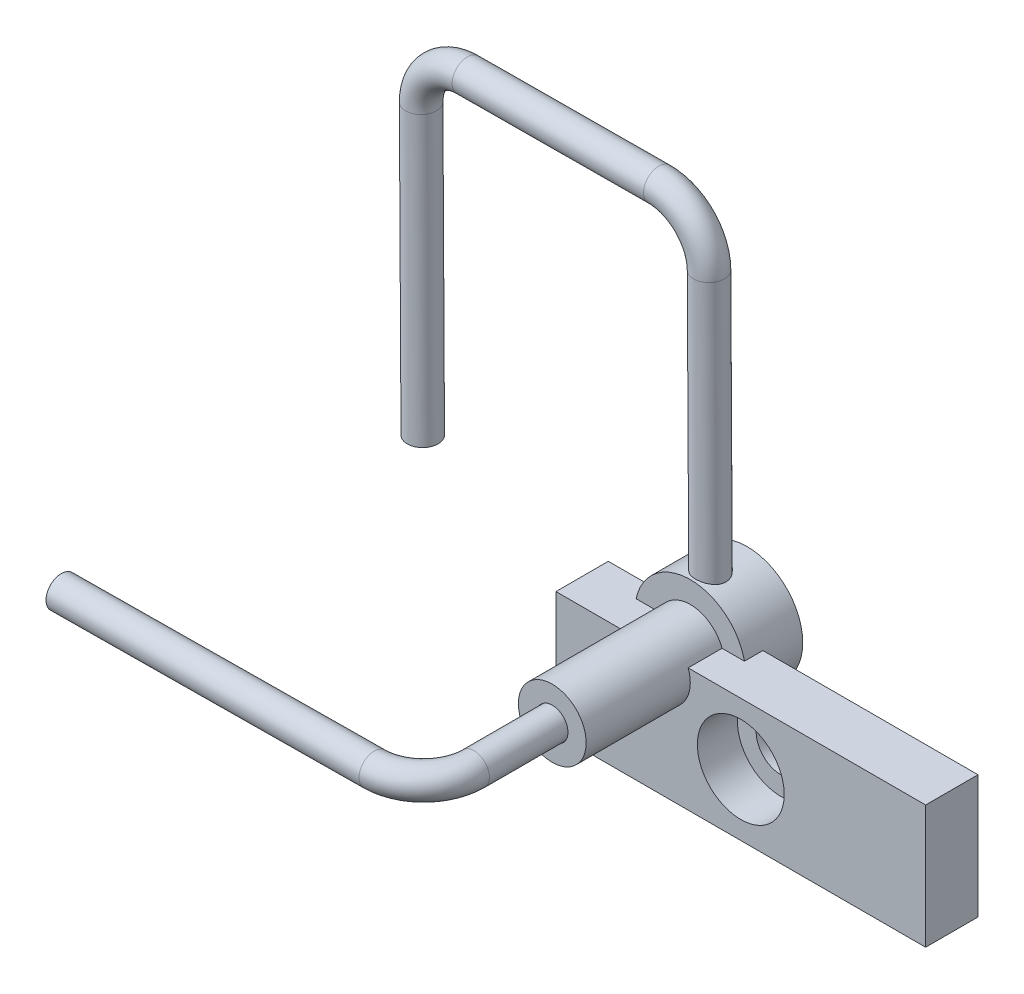
ISO-10303-21;
HEADER;
FILE_DESCRIPTION(('STEP AP214'),'2;1');
FILE_NAME('part.step','',(''),(''),'','','');
FILE_SCHEMA(('AUTOMOTIVE_DESIGN { 1 0 10303 214 1 1 1 1 }'));
ENDSEC;
DATA;
#1=APPLICATION_CONTEXT('core data for automotive mechanical design processes');
#2=APPLICATION_PROTOCOL_DEFINITION('international standard','automotive_design',2000,#1);
#3=PRODUCT_CONTEXT('',#1,'mechanical');
#4=PRODUCT('Part','Part','',(#3));
#5=PRODUCT_RELATED_PRODUCT_CATEGORY('part','',(#4));
#6=PRODUCT_DEFINITION_FORMATION('','',#4);
#7=PRODUCT_DEFINITION_CONTEXT('part definition',#1,'design');
#8=PRODUCT_DEFINITION('design','',#6,#7);
#9=PRODUCT_DEFINITION_SHAPE('','',#8);
#10=(LENGTH_UNIT() NAMED_UNIT(*) SI_UNIT(.MILLI.,.METRE.));
#11=(NAMED_UNIT(*) PLANE_ANGLE_UNIT() SI_UNIT($,.RADIAN.));
#12=(NAMED_UNIT(*) SI_UNIT($,.STERADIAN.) SOLID_ANGLE_UNIT());
#13=UNCERTAINTY_MEASURE_WITH_UNIT(LENGTH_MEASURE(1.E-05),#10,'distance_accuracy_value','');
#14=(GEOMETRIC_REPRESENTATION_CONTEXT(3) GLOBAL_UNCERTAINTY_ASSIGNED_CONTEXT((#13)) GLOBAL_UNIT_ASSIGNED_CONTEXT((#10,
#11,#12)) REPRESENTATION_CONTEXT('',''));
#15=CARTESIAN_POINT('',(0.,0.,0.));
#16=DIRECTION('',(0.,0.,1.));
#17=DIRECTION('',(1.,0.,0.));
#18=AXIS2_PLACEMENT_3D('',#15,#16,#17);
#19=CARTESIAN_POINT('',(43.694582367874,0.,8.5));
#20=DIRECTION('',(-1.,0.,0.));
#21=DIRECTION('',(0.,0.,1.));
#22=AXIS2_PLACEMENT_3D('',#19,#20,#21);
#23=PLANE('',#22);
#24=DIRECTION('',(0.,0.,-1.));
#25=VECTOR('',#24,1.);
#26=CARTESIAN_POINT('',(43.694582367874,-18.0858213584229,8.5));
#27=LINE('',#26,#25);
#28=CARTESIAN_POINT('',(43.694582367874,-18.0858213584229,8.5));
#29=VERTEX_POINT('',#28);
#30=CARTESIAN_POINT('',(43.694582367874,-18.0858213584229,0.));
#31=VERTEX_POINT('',#30);
#32=EDGE_CURVE('E165',#29,#31,#27,.T.);
#33=ORIENTED_EDGE('',*,*,#32,.T.);
#34=DIRECTION('',(0.,1.,0.));
#35=VECTOR('',#34,1.);
#36=CARTESIAN_POINT('',(43.694582367874,0.,0.));
#37=LINE('',#36,#35);
#38=CARTESIAN_POINT('',(43.694582367874,1.91417864157713,0.));
#39=VERTEX_POINT('',#38);
#40=EDGE_CURVE('E224',#31,#39,#37,.T.);
#41=ORIENTED_EDGE('',*,*,#40,.T.);
#42=DIRECTION('',(0.,0.,-1.));
#43=VECTOR('',#42,1.);
#44=CARTESIAN_POINT('',(43.694582367874,1.91417864157713,8.5));
#45=LINE('',#44,#43);
#46=CARTESIAN_POINT('',(43.694582367874,1.91417864157713,8.5));
#47=VERTEX_POINT('',#46);
#48=EDGE_CURVE('E157',#47,#39,#45,.T.);
#49=ORIENTED_EDGE('',*,*,#48,.F.);
#50=DIRECTION('',(0.,1.,0.));
#51=VECTOR('',#50,1.);
#52=CARTESIAN_POINT('',(43.694582367874,0.,8.5));
#53=LINE('',#52,#51);
#54=EDGE_CURVE('E190',#29,#47,#53,.T.);
#55=ORIENTED_EDGE('',*,*,#54,.F.);
#56=EDGE_LOOP('',(#33,#41,#49,#55));
#57=FACE_BOUND('',#56,.T.);
#58=ADVANCED_FACE('F148',(#57),#23,.F.);
#59=CARTESIAN_POINT('',(0.,1.91417864157713,8.5));
#60=DIRECTION('',(0.,1.,0.));
#61=DIRECTION('',(0.,0.,1.));
#62=AXIS2_PLACEMENT_3D('',#59,#60,#61);
#63=PLANE('',#62);
#64=ORIENTED_EDGE('',*,*,#48,.T.);
#65=DIRECTION('',(1.,0.,0.));
#66=VECTOR('',#65,1.);
#67=CARTESIAN_POINT('',(0.,1.91417864157713,0.));
#68=LINE('',#67,#66);
#69=CARTESIAN_POINT('',(-16.305417632126,1.91417864157713,0.));
#70=VERTEX_POINT('',#69);
#71=EDGE_CURVE('E200',#70,#39,#68,.T.);
#72=ORIENTED_EDGE('',*,*,#71,.F.);
#73=DIRECTION('',(0.,0.,-1.));
#74=VECTOR('',#73,1.);
#75=CARTESIAN_POINT('',(-16.305417632126,1.91417864157713,8.5));
#76=LINE('',#75,#74);
#77=CARTESIAN_POINT('',(-16.305417632126,1.91417864157713,8.5));
#78=VERTEX_POINT('',#77);
#79=EDGE_CURVE('E196',#78,#70,#76,.T.);
#80=ORIENTED_EDGE('',*,*,#79,.F.);
#81=DIRECTION('',(1.,0.,0.));
#82=VECTOR('',#81,1.);
#83=CARTESIAN_POINT('',(0.,1.91417864157713,8.5));
#84=LINE('',#83,#82);
#85=EDGE_CURVE('E198',#78,#47,#84,.T.);
#86=ORIENTED_EDGE('',*,*,#85,.T.);
#87=EDGE_LOOP('',(#64,#72,#80,#86));
#88=FACE_BOUND('',#87,.T.);
#89=ADVANCED_FACE('F197',(#88),#63,.T.);
#90=CARTESIAN_POINT('',(-16.305417632126,0.,8.5));
#91=DIRECTION('',(-1.,0.,0.));
#92=DIRECTION('',(0.,0.,1.));
#93=AXIS2_PLACEMENT_3D('',#90,#91,#92);
#94=PLANE('',#93);
#95=ORIENTED_EDGE('',*,*,#79,.T.);
#96=DIRECTION('',(0.,1.,0.));
#97=VECTOR('',#96,1.);
#98=CARTESIAN_POINT('',(-16.305417632126,0.,0.));
#99=LINE('',#98,#97);
#100=CARTESIAN_POINT('',(-16.305417632126,-18.0858213584229,0.));
#101=VERTEX_POINT('',#100);
#102=EDGE_CURVE('E230',#101,#70,#99,.T.);
#103=ORIENTED_EDGE('',*,*,#102,.F.);
#104=DIRECTION('',(0.,0.,-1.));
#105=VECTOR('',#104,1.);
#106=CARTESIAN_POINT('',(-16.305417632126,-18.0858213584229,8.5));
#107=LINE('',#106,#105);
#108=CARTESIAN_POINT('',(-16.305417632126,-18.0858213584229,8.5));
#109=VERTEX_POINT('',#108);
#110=EDGE_CURVE('E179',#109,#101,#107,.T.);
#111=ORIENTED_EDGE('',*,*,#110,.F.);
#112=DIRECTION('',(0.,1.,0.));
#113=VECTOR('',#112,1.);
#114=CARTESIAN_POINT('',(-16.305417632126,0.,8.5));
#115=LINE('',#114,#113);
#116=EDGE_CURVE('E209',#109,#78,#115,.T.);
#117=ORIENTED_EDGE('',*,*,#116,.T.);
#118=EDGE_LOOP('',(#95,#103,#111,#117));
#119=FACE_BOUND('',#118,.T.);
#120=ADVANCED_FACE('F212',(#119),#94,.T.);
#121=CARTESIAN_POINT('',(0.,-18.0858213584229,8.5));
#122=DIRECTION('',(0.,-1.,0.));
#123=DIRECTION('',(1.,0.,0.));
#124=AXIS2_PLACEMENT_3D('',#121,#122,#123);
#125=PLANE('',#124);
#126=ORIENTED_EDGE('',*,*,#110,.T.);
#127=DIRECTION('',(-1.,0.,0.));
#128=VECTOR('',#127,1.);
#129=CARTESIAN_POINT('',(0.,-18.0858213584229,0.));
#130=LINE('',#129,#128);
#131=EDGE_CURVE('E233',#31,#101,#130,.T.);
#132=ORIENTED_EDGE('',*,*,#131,.F.);
#133=ORIENTED_EDGE('',*,*,#32,.F.);
#134=DIRECTION('',(-1.,0.,0.));
#135=VECTOR('',#134,1.);
#136=CARTESIAN_POINT('',(0.,-18.0858213584229,8.5));
#137=LINE('',#136,#135);
#138=EDGE_CURVE('E214',#29,#109,#137,.T.);
#139=ORIENTED_EDGE('',*,*,#138,.T.);
#140=EDGE_LOOP('',(#126,#132,#133,#139));
#141=FACE_BOUND('',#140,.T.);
#142=ADVANCED_FACE('F244',(#141),#125,.T.);
#143=CARTESIAN_POINT('',(13.694582367874,-8.08582135842287,8.5));
#144=DIRECTION('',(0.,0.,-1.));
#145=DIRECTION('',(-1.,0.,0.));
#146=AXIS2_PLACEMENT_3D('',#143,#144,#145);
#147=CYLINDRICAL_SURFACE('',#146,7.05);
#148=CARTESIAN_POINT('',(13.694582367874,-8.08582135842287,2.));
#149=DIRECTION('',(0.,0.,1.));
#150=DIRECTION('',(1.,0.,0.));
#151=AXIS2_PLACEMENT_3D('',#148,#149,#150);
#152=CIRCLE('',#151,7.05);
#153=CARTESIAN_POINT('',(20.744582367874,-8.08582135842287,2.));
#154=VERTEX_POINT('',#153);
#155=EDGE_CURVE('E14',#154,#154,#152,.T.);
#156=ORIENTED_EDGE('',*,*,#155,.F.);
#157=EDGE_LOOP('',(#156));
#158=FACE_BOUND('',#157,.T.);
#159=CARTESIAN_POINT('',(13.694582367874,-8.08582135842287,8.5));
#160=DIRECTION('',(0.,0.,1.));
#161=DIRECTION('',(1.,0.,0.));
#162=AXIS2_PLACEMENT_3D('',#159,#160,#161);
#163=CIRCLE('',#162,7.05);
#164=CARTESIAN_POINT('',(20.744582367874,-8.08582135842287,8.5));
#165=VERTEX_POINT('',#164);
#166=EDGE_CURVE('E217',#165,#165,#163,.T.);
#167=ORIENTED_EDGE('',*,*,#166,.T.);
#168=EDGE_LOOP('',(#167));
#169=FACE_BOUND('',#168,.T.);
#170=ADVANCED_FACE('F246',(#158,#169),#147,.F.);
#171=CARTESIAN_POINT('',(0.,0.,8.5));
#172=DIRECTION('',(0.,0.,1.));
#173=DIRECTION('',(1.,0.,0.));
#174=AXIS2_PLACEMENT_3D('',#171,#172,#173);
#175=PLANE('',#174);
#176=ORIENTED_EDGE('',*,*,#54,.T.);
#177=ORIENTED_EDGE('',*,*,#85,.F.);
#178=ORIENTED_EDGE('',*,*,#116,.F.);
#179=ORIENTED_EDGE('',*,*,#138,.F.);
#180=EDGE_LOOP('',(#176,#177,#178,#179));
#181=FACE_BOUND('',#180,.T.);
#182=ORIENTED_EDGE('',*,*,#166,.F.);
#183=EDGE_LOOP('',(#182));
#184=FACE_BOUND('',#183,.T.);
#185=ADVANCED_FACE('F207',(#181,#184),#175,.T.);
#186=CARTESIAN_POINT('',(0.,0.,0.));
#187=DIRECTION('',(0.,0.,1.));
#188=DIRECTION('',(1.,0.,0.));
#189=AXIS2_PLACEMENT_3D('',#186,#187,#188);
#190=PLANE('',#189);
#191=ORIENTED_EDGE('',*,*,#40,.F.);
#192=ORIENTED_EDGE('',*,*,#131,.T.);
#193=ORIENTED_EDGE('',*,*,#102,.T.);
#194=ORIENTED_EDGE('',*,*,#71,.T.);
#195=EDGE_LOOP('',(#191,#192,#193,#194));
#196=FACE_BOUND('',#195,.T.);
#197=CARTESIAN_POINT('',(13.694582367874,-8.08582135842287,0.));
#198=DIRECTION('',(0.,0.,1.));
#199=DIRECTION('',(1.,0.,0.));
#200=AXIS2_PLACEMENT_3D('',#197,#198,#199);
#201=CIRCLE('',#200,4.);
#202=CARTESIAN_POINT('',(17.694582367874,-8.08582135842287,0.));
#203=VERTEX_POINT('',#202);
#204=EDGE_CURVE('E350',#203,#203,#201,.T.);
#205=ORIENTED_EDGE('',*,*,#204,.T.);
#206=EDGE_LOOP('',(#205));
#207=FACE_BOUND('',#206,.T.);
#208=ADVANCED_FACE('F242',(#196,#207),#190,.F.);
#209=CARTESIAN_POINT('',(0.,0.,2.));
#210=DIRECTION('',(0.,0.,1.));
#211=DIRECTION('',(1.,0.,0.));
#212=AXIS2_PLACEMENT_3D('',#209,#210,#211);
#213=PLANE('',#212);
#214=CARTESIAN_POINT('',(13.694582367874,-8.08582135842287,2.));
#215=DIRECTION('',(0.,0.,1.));
#216=DIRECTION('',(1.,0.,0.));
#217=AXIS2_PLACEMENT_3D('',#214,#215,#216);
#218=CIRCLE('',#217,4.);
#219=CARTESIAN_POINT('',(17.694582367874,-8.08582135842287,2.));
#220=VERTEX_POINT('',#219);
#221=EDGE_CURVE('E227',#220,#220,#218,.T.);
#222=ORIENTED_EDGE('',*,*,#221,.F.);
#223=EDGE_LOOP('',(#222));
#224=FACE_BOUND('',#223,.T.);
#225=ORIENTED_EDGE('',*,*,#155,.T.);
#226=EDGE_LOOP('',(#225));
#227=FACE_BOUND('',#226,.T.);
#228=ADVANCED_FACE('F287',(#224,#227),#213,.T.);
#229=CARTESIAN_POINT('',(13.694582367874,-8.08582135842287,2.));
#230=DIRECTION('',(0.,0.,-1.));
#231=DIRECTION('',(-1.,0.,0.));
#232=AXIS2_PLACEMENT_3D('',#229,#230,#231);
#233=CYLINDRICAL_SURFACE('',#232,4.);
#234=ORIENTED_EDGE('',*,*,#221,.T.);
#235=EDGE_LOOP('',(#234));
#236=FACE_BOUND('',#235,.T.);
#237=ORIENTED_EDGE('',*,*,#204,.F.);
#238=EDGE_LOOP('',(#237));
#239=FACE_BOUND('',#238,.T.);
#240=ADVANCED_FACE('F298',(#236,#239),#233,.F.);
#241=CLOSED_SHELL('',(#58,#89,#120,#142,#170,#185,#208,#228,#240));
#242=MANIFOLD_SOLID_BREP('B2',#241);
#243=CARTESIAN_POINT('',(0.,0.,0.));
#244=DIRECTION('',(0.,0.,1.));
#245=DIRECTION('',(1.,0.,0.));
#246=AXIS2_PLACEMENT_3D('',#243,#244,#245);
#247=PLANE('',#246);
#248=CARTESIAN_POINT('',(0.,0.,0.));
#249=DIRECTION('',(0.,0.,1.));
#250=DIRECTION('',(1.,0.,0.));
#251=AXIS2_PLACEMENT_3D('',#248,#249,#250);
#252=CIRCLE('',#251,2.55);
#253=CARTESIAN_POINT('',(2.55,0.,0.));
#254=VERTEX_POINT('',#253);
#255=EDGE_CURVE('E395',#254,#254,#252,.T.);
#256=ORIENTED_EDGE('',*,*,#255,.T.);
#257=EDGE_LOOP('',(#256));
#258=FACE_BOUND('',#257,.T.);
#259=CARTESIAN_POINT('',(0.,0.,0.));
#260=DIRECTION('',(0.,0.,1.));
#261=DIRECTION('',(1.,0.,0.));
#262=AXIS2_PLACEMENT_3D('',#259,#260,#261);
#263=CIRCLE('',#262,7.05);
#264=CARTESIAN_POINT('',(7.05,0.,0.));
#265=VERTEX_POINT('',#264);
#266=EDGE_CURVE('E147',#265,#265,#263,.T.);
#267=ORIENTED_EDGE('',*,*,#266,.F.);
#268=EDGE_LOOP('',(#267));
#269=FACE_BOUND('',#268,.T.);
#270=ADVANCED_FACE('F379',(#258,#269),#247,.F.);
#271=CARTESIAN_POINT('',(0.,0.,25.4));
#272=DIRECTION('',(0.,0.,-1.));
#273=DIRECTION('',(-1.,0.,0.));
#274=AXIS2_PLACEMENT_3D('',#271,#272,#273);
#275=CYLINDRICAL_SURFACE('',#274,2.55);
#276=CARTESIAN_POINT('',(0.,0.,25.4));
#277=DIRECTION('',(0.,0.,1.));
#278=DIRECTION('',(1.,0.,0.));
#279=AXIS2_PLACEMENT_3D('',#276,#277,#278);
#280=CIRCLE('',#279,2.55);
#281=CARTESIAN_POINT('',(2.55,0.,25.4));
#282=VERTEX_POINT('',#281);
#283=EDGE_CURVE('E390',#282,#282,#280,.T.);
#284=ORIENTED_EDGE('',*,*,#283,.T.);
#285=EDGE_LOOP('',(#284));
#286=FACE_BOUND('',#285,.T.);
#287=ORIENTED_EDGE('',*,*,#255,.F.);
#288=EDGE_LOOP('',(#287));
#289=FACE_BOUND('',#288,.T.);
#290=ADVANCED_FACE('F381',(#286,#289),#275,.F.);
#291=CARTESIAN_POINT('',(0.,0.,25.4));
#292=DIRECTION('',(0.,0.,-1.));
#293=DIRECTION('',(-1.,0.,0.));
#294=AXIS2_PLACEMENT_3D('',#291,#292,#293);
#295=CYLINDRICAL_SURFACE('',#294,5.5);
#296=CARTESIAN_POINT('',(0.,0.,3.));
#297=DIRECTION('',(0.,0.,1.));
#298=DIRECTION('',(1.,0.,0.));
#299=AXIS2_PLACEMENT_3D('',#296,#297,#298);
#300=CIRCLE('',#299,5.5);
#301=CARTESIAN_POINT('',(5.5,0.,3.));
#302=VERTEX_POINT('',#301);
#303=EDGE_CURVE('E403',#302,#302,#300,.T.);
#304=ORIENTED_EDGE('',*,*,#303,.T.);
#305=EDGE_LOOP('',(#304));
#306=FACE_BOUND('',#305,.T.);
#307=CARTESIAN_POINT('',(0.,0.,25.4));
#308=DIRECTION('',(0.,0.,1.));
#309=DIRECTION('',(1.,0.,0.));
#310=AXIS2_PLACEMENT_3D('',#307,#308,#309);
#311=CIRCLE('',#310,5.5);
#312=CARTESIAN_POINT('',(5.5,0.,25.4));
#313=VERTEX_POINT('',#312);
#314=EDGE_CURVE('E386',#313,#313,#311,.T.);
#315=ORIENTED_EDGE('',*,*,#314,.F.);
#316=EDGE_LOOP('',(#315));
#317=FACE_BOUND('',#316,.T.);
#318=ADVANCED_FACE('F436',(#306,#317),#295,.T.);
#319=CARTESIAN_POINT('',(0.,0.,25.4));
#320=DIRECTION('',(0.,0.,1.));
#321=DIRECTION('',(1.,0.,0.));
#322=AXIS2_PLACEMENT_3D('',#319,#320,#321);
#323=PLANE('',#322);
#324=ORIENTED_EDGE('',*,*,#283,.F.);
#325=EDGE_LOOP('',(#324));
#326=FACE_BOUND('',#325,.T.);
#327=ORIENTED_EDGE('',*,*,#314,.T.);
#328=EDGE_LOOP('',(#327));
#329=FACE_BOUND('',#328,.T.);
#330=ADVANCED_FACE('F440',(#326,#329),#323,.T.);
#331=CARTESIAN_POINT('',(0.,0.,3.));
#332=DIRECTION('',(0.,0.,-1.));
#333=DIRECTION('',(-1.,0.,0.));
#334=AXIS2_PLACEMENT_3D('',#331,#332,#333);
#335=CYLINDRICAL_SURFACE('',#334,9.);
#336=CARTESIAN_POINT('',(0.,0.,3.));
#337=DIRECTION('',(0.,0.,1.));
#338=DIRECTION('',(1.,0.,0.));
#339=AXIS2_PLACEMENT_3D('',#336,#337,#338);
#340=CIRCLE('',#339,9.);
#341=CARTESIAN_POINT('',(9.,0.,3.));
#342=VERTEX_POINT('',#341);
#343=EDGE_CURVE('E399',#342,#342,#340,.T.);
#344=ORIENTED_EDGE('',*,*,#343,.F.);
#345=EDGE_LOOP('',(#344));
#346=FACE_BOUND('',#345,.T.);
#347=CARTESIAN_POINT('',(0.,0.,-6.25));
#348=DIRECTION('',(0.,0.,1.));
#349=DIRECTION('',(1.,0.,0.));
#350=AXIS2_PLACEMENT_3D('',#347,#348,#349);
#351=CIRCLE('',#350,9.);
#352=CARTESIAN_POINT('',(9.,0.,-6.25));
#353=VERTEX_POINT('',#352);
#354=EDGE_CURVE('E407',#353,#353,#351,.T.);
#355=ORIENTED_EDGE('',*,*,#354,.T.);
#356=EDGE_LOOP('',(#355));
#357=FACE_BOUND('',#356,.T.);
#358=ADVANCED_FACE('F428',(#346,#357),#335,.T.);
#359=CARTESIAN_POINT('',(0.,0.,3.));
#360=DIRECTION('',(0.,0.,1.));
#361=DIRECTION('',(1.,0.,0.));
#362=AXIS2_PLACEMENT_3D('',#359,#360,#361);
#363=PLANE('',#362);
#364=ORIENTED_EDGE('',*,*,#303,.F.);
#365=EDGE_LOOP('',(#364));
#366=FACE_BOUND('',#365,.T.);
#367=ORIENTED_EDGE('',*,*,#343,.T.);
#368=EDGE_LOOP('',(#367));
#369=FACE_BOUND('',#368,.T.);
#370=ADVANCED_FACE('F421',(#366,#369),#363,.T.);
#371=CARTESIAN_POINT('',(0.,0.,-6.25));
#372=DIRECTION('',(0.,0.,1.));
#373=DIRECTION('',(1.,0.,0.));
#374=AXIS2_PLACEMENT_3D('',#371,#372,#373);
#375=CYLINDRICAL_SURFACE('',#374,7.05);
#376=CARTESIAN_POINT('',(0.,0.,-6.25));
#377=DIRECTION('',(0.,0.,1.));
#378=DIRECTION('',(1.,0.,0.));
#379=AXIS2_PLACEMENT_3D('',#376,#377,#378);
#380=CIRCLE('',#379,7.05);
#381=CARTESIAN_POINT('',(7.05,0.,-6.25));
#382=VERTEX_POINT('',#381);
#383=EDGE_CURVE('E412',#382,#382,#380,.T.);
#384=ORIENTED_EDGE('',*,*,#383,.F.);
#385=EDGE_LOOP('',(#384));
#386=FACE_BOUND('',#385,.T.);
#387=ORIENTED_EDGE('',*,*,#266,.T.);
#388=EDGE_LOOP('',(#387));
#389=FACE_BOUND('',#388,.T.);
#390=ADVANCED_FACE('F419',(#386,#389),#375,.F.);
#391=CARTESIAN_POINT('',(0.,0.,-6.25));
#392=DIRECTION('',(0.,0.,1.));
#393=DIRECTION('',(1.,0.,0.));
#394=AXIS2_PLACEMENT_3D('',#391,#392,#393);
#395=PLANE('',#394);
#396=ORIENTED_EDGE('',*,*,#383,.T.);
#397=EDGE_LOOP('',(#396));
#398=FACE_BOUND('',#397,.T.);
#399=ORIENTED_EDGE('',*,*,#354,.F.);
#400=EDGE_LOOP('',(#399));
#401=FACE_BOUND('',#400,.T.);
#402=ADVANCED_FACE('F416',(#398,#401),#395,.F.);
#403=CLOSED_SHELL('',(#270,#290,#318,#330,#358,#370,#390,#402));
#404=MANIFOLD_SOLID_BREP('B8_NOT_SHOWN',#403);
#405=CARTESIAN_POINT('',(0.,0.,101.6));
#406=DIRECTION('',(0.,0.,-1.));
#407=DIRECTION('',(-1.,0.,0.));
#408=AXIS2_PLACEMENT_3D('',#405,#406,#407);
#409=CYLINDRICAL_SURFACE('',#408,2.5);
#410=CARTESIAN_POINT('',(0.,0.,0.));
#411=DIRECTION('',(0.,0.,1.));
#412=DIRECTION('',(1.,0.,0.));
#413=AXIS2_PLACEMENT_3D('',#410,#411,#412);
#414=CIRCLE('',#413,2.5);
#415=CARTESIAN_POINT('',(2.5,0.,0.));
#416=VERTEX_POINT('',#415);
#417=EDGE_CURVE('E532',#416,#416,#414,.T.);
#418=ORIENTED_EDGE('',*,*,#417,.T.);
#419=EDGE_LOOP('',(#418));
#420=FACE_BOUND('',#419,.T.);
#421=CARTESIAN_POINT('',(0.,0.,38.1));
#422=DIRECTION('',(0.,0.,1.));
#423=DIRECTION('',(1.,0.,0.));
#424=AXIS2_PLACEMENT_3D('',#421,#422,#423);
#425=CIRCLE('',#424,2.5);
#426=CARTESIAN_POINT('',(2.49990480766043,0.0218163387459008,38.1));
#427=VERTEX_POINT('',#426);
#428=EDGE_CURVE('E527',#427,#427,#425,.T.);
#429=ORIENTED_EDGE('',*,*,#428,.F.);
#430=EDGE_LOOP('',(#429));
#431=FACE_BOUND('',#430,.T.);
#432=ADVANCED_FACE('F519',(#420,#431),#409,.T.);
#433=CARTESIAN_POINT('',(-8.08476325433448,-0.0705546600400517,38.1));
#434=DIRECTION('',(0.00872653549836032,-0.999961923064171,0.));
#435=DIRECTION('',(0.999961923064171,0.00872653549836032,0.));
#436=AXIS2_PLACEMENT_3D('',#433,#434,#435);
#437=TOROIDAL_SURFACE('',#436,8.08507110906827,2.5);
#438=CARTESIAN_POINT('',(-8.08476325433451,-0.0705546600400519,46.1850711090683));
#439=DIRECTION('',(-0.999961923064171,-0.00872653549836032,0.));
#440=DIRECTION('',(7.61524218006515E-05,-0.00872620321862817,0.999961923064171));
#441=AXIS2_PLACEMENT_3D('',#438,#439,#440);
#442=CIRCLE('',#441,2.5);
#443=CARTESIAN_POINT('',(-8.08476325433451,-0.070554660040052,48.6850711090683));
#444=VERTEX_POINT('',#443);
#445=EDGE_CURVE('E378',#444,#444,#442,.T.);
#446=CARTESIAN_POINT('',(-8.08476325433448,-0.0705546600400517,38.1));
#447=DIRECTION('',(0.00872653549836032,-0.999961923064171,0.));
#448=DIRECTION('',(0.999961923064171,0.00872653549836032,0.));
#449=AXIS2_PLACEMENT_3D('',#446,#447,#448);
#450=CIRCLE('',#449,10.5850711090683);
#451=EDGE_CURVE('',#427,#444,#450,.T.);
#452=ORIENTED_EDGE('',*,*,#428,.T.);
#453=ORIENTED_EDGE('',*,*,#445,.F.);
#454=ORIENTED_EDGE('',*,*,#451,.T.);
#455=ORIENTED_EDGE('',*,*,#451,.F.);
#456=EDGE_LOOP('',(#452,#454,#453,#455));
#457=FACE_BOUND('',#456,.T.);
#458=ADVANCED_FACE('F552',(#457),#437,.T.);
#459=CARTESIAN_POINT('',(-58.8828289459944,-0.513862663356756,46.1850711090681));
#460=DIRECTION('',(0.999961923064171,0.00872653549836032,0.));
#461=DIRECTION('',(-7.61524218006515E-05,0.00872620321862817,-0.999961923064171));
#462=AXIS2_PLACEMENT_3D('',#459,#460,#461);
#463=CYLINDRICAL_SURFACE('',#462,2.5);
#464=ORIENTED_EDGE('',*,*,#445,.T.);
#465=EDGE_LOOP('',(#464));
#466=FACE_BOUND('',#465,.T.);
#467=CARTESIAN_POINT('',(-58.8828289459944,-0.513862663356756,46.1850711090681));
#468=DIRECTION('',(-0.999961923064171,-0.00872653549836032,0.));
#469=DIRECTION('',(7.61524218006515E-05,-0.00872620321862817,0.999961923064171));
#470=AXIS2_PLACEMENT_3D('',#467,#468,#469);
#471=CIRCLE('',#470,2.5);
#472=CARTESIAN_POINT('',(-58.8826385649399,-0.535678171403326,48.6849759167285));
#473=VERTEX_POINT('',#472);
#474=EDGE_CURVE('E535',#473,#473,#471,.T.);
#475=ORIENTED_EDGE('',*,*,#474,.F.);
#476=EDGE_LOOP('',(#475));
#477=FACE_BOUND('',#476,.T.);
#478=ADVANCED_FACE('F549',(#466,#477),#463,.T.);
#479=CARTESIAN_POINT('',(-58.8828289459944,-0.513862663356756,46.1850711090681));
#480=DIRECTION('',(-0.999961923064171,-0.00872653549836032,0.));
#481=DIRECTION('',(7.61524218006515E-05,-0.00872620321862817,0.999961923064171));
#482=AXIS2_PLACEMENT_3D('',#479,#480,#481);
#483=PLANE('',#482);
#484=ORIENTED_EDGE('',*,*,#474,.T.);
#485=EDGE_LOOP('',(#484));
#486=FACE_BOUND('',#485,.T.);
#487=ADVANCED_FACE('F545',(#486),#483,.T.);
#488=CARTESIAN_POINT('',(0.,0.,0.));
#489=DIRECTION('',(0.,0.,1.));
#490=DIRECTION('',(1.,0.,0.));
#491=AXIS2_PLACEMENT_3D('',#488,#489,#490);
#492=PLANE('',#491);
#493=ORIENTED_EDGE('',*,*,#417,.F.);
#494=EDGE_LOOP('',(#493));
#495=FACE_BOUND('',#494,.T.);
#496=ADVANCED_FACE('F521',(#495),#492,.F.);
#497=CLOSED_SHELL('',(#432,#458,#478,#487,#496));
#498=MANIFOLD_SOLID_BREP('B142_NOT_SHOWN',#497);
#499=CARTESIAN_POINT('',(-46.420753356991,4.59161939468769,-1.76544371842712E-13));
#500=DIRECTION('',(-0.00563734568943531,0.999984110040543,0.));
#501=DIRECTION('',(0.,0.,-1.));
#502=AXIS2_PLACEMENT_3D('',#499,#500,#501);
#503=CYLINDRICAL_SURFACE('',#502,2.5);
#504=CARTESIAN_POINT('',(-46.6839243014587,51.2743628683252,0.));
#505=DIRECTION('',(-0.00563734568943116,0.999984110040544,0.));
#506=DIRECTION('',(0.,0.,-1.));
#507=AXIS2_PLACEMENT_3D('',#504,#505,#506);
#508=CIRCLE('',#507,2.5);
#509=CARTESIAN_POINT('',(-46.6839243014588,51.2743628683252,-2.50000000000001));
#510=VERTEX_POINT('',#509);
#511=EDGE_CURVE('E518',#510,#510,#508,.T.);
#512=ORIENTED_EDGE('',*,*,#511,.F.);
#513=EDGE_LOOP('',(#512));
#514=FACE_BOUND('',#513,.T.);
#515=CARTESIAN_POINT('',(-46.420753356991,4.59161939468769,-1.76544371842712E-13));
#516=DIRECTION('',(0.00563734568943531,-0.999984110040544,0.));
#517=DIRECTION('',(0.,0.,1.));
#518=AXIS2_PLACEMENT_3D('',#515,#516,#517);
#519=CIRCLE('',#518,2.5);
#520=CARTESIAN_POINT('',(-46.420753356991,4.59161939468768,2.49999999999982));
#521=VERTEX_POINT('',#520);
#522=EDGE_CURVE('E621',#521,#521,#519,.T.);
#523=ORIENTED_EDGE('',*,*,#522,.F.);
#524=EDGE_LOOP('',(#523));
#525=FACE_BOUND('',#524,.T.);
#526=ADVANCED_FACE('F593',(#514,#525),#503,.T.);
#527=CARTESIAN_POINT('',(-8.04265016746616,50.9751657825808,0.));
#528=DIRECTION('',(0.,0.,1.));
#529=DIRECTION('',(0.999984110040544,0.00563734568942783,0.));
#530=AXIS2_PLACEMENT_3D('',#527,#528,#529);
#531=TOROIDAL_SURFACE('',#530,8.08507110906829,2.5);
#532=CARTESIAN_POINT('',(-8.08822850823162,59.0601084201969,0.));
#533=DIRECTION('',(-0.999984110040544,-0.00563734568943199,0.));
#534=DIRECTION('',(0.,0.,1.));
#535=AXIS2_PLACEMENT_3D('',#532,#533,#534);
#536=CIRCLE('',#535,2.5);
#537=CARTESIAN_POINT('',(-8.08822850823162,59.0601084201969,2.5));
#538=VERTEX_POINT('',#537);
#539=EDGE_CURVE('E606',#538,#538,#536,.T.);
#540=ORIENTED_EDGE('',*,*,#539,.F.);
#541=EDGE_LOOP('',(#540));
#542=FACE_BOUND('',#541,.T.);
#543=CARTESIAN_POINT('',(0.0422924701500044,51.0207441233462,0.));
#544=DIRECTION('',(-0.00563734568942783,0.999984110040544,0.));
#545=DIRECTION('',(0.,0.,1.));
#546=AXIS2_PLACEMENT_3D('',#543,#544,#545);
#547=CIRCLE('',#546,2.5);
#548=CARTESIAN_POINT('',(0.0422924701500042,51.0207441233462,-2.5));
#549=VERTEX_POINT('',#548);
#550=EDGE_CURVE('E618',#549,#549,#547,.T.);
#551=ORIENTED_EDGE('',*,*,#550,.T.);
#552=EDGE_LOOP('',(#551));
#553=FACE_BOUND('',#552,.T.);
#554=ADVANCED_FACE('F633',(#542,#553),#531,.T.);
#555=CARTESIAN_POINT('',(-0.530461851895863,152.619129703465,0.));
#556=DIRECTION('',(0.00563734568942783,-0.999984110040543,0.));
#557=DIRECTION('',(0.,0.,-1.));
#558=AXIS2_PLACEMENT_3D('',#555,#556,#557);
#559=CYLINDRICAL_SURFACE('',#558,2.5);
#560=CARTESIAN_POINT('',(0.328669631172938,0.221551333286567,0.));
#561=DIRECTION('',(-0.00563734568942783,0.999984110040544,0.));
#562=DIRECTION('',(0.,0.,1.));
#563=AXIS2_PLACEMENT_3D('',#560,#561,#562);
#564=CIRCLE('',#563,2.5);
#565=CARTESIAN_POINT('',(0.328669631172938,0.221551333286552,-2.5));
#566=VERTEX_POINT('',#565);
#567=EDGE_CURVE('E615',#566,#566,#564,.T.);
#568=CARTESIAN_POINT('',(0.328669631172938,0.221551333286552,-2.5));
#569=CARTESIAN_POINT('',(0.325686535745616,0.750709591516342,-2.5));
#570=CARTESIAN_POINT('',(0.322703440318294,1.27986784974613,-2.5));
#571=CARTESIAN_POINT('',(0.316737249463649,2.33818436620572,-2.5));
#572=CARTESIAN_POINT('',(0.313754154036327,2.86734262443551,-2.5));
#573=CARTESIAN_POINT('',(0.307787963181683,3.92565914089508,-2.5));
#574=CARTESIAN_POINT('',(0.30480486775436,4.45481739912486,-2.5));
#575=CARTESIAN_POINT('',(0.298838676899716,5.51313391558444,-2.5));
#576=CARTESIAN_POINT('',(0.295855581472394,6.04229217381423,-2.5));
#577=CARTESIAN_POINT('',(0.289889390617749,7.10060869027381,-2.5));
#578=CARTESIAN_POINT('',(0.286906295190427,7.6297669485036,-2.5));
#579=CARTESIAN_POINT('',(0.280940104335783,8.68808346496317,-2.5));
#580=CARTESIAN_POINT('',(0.27795700890846,9.21724172319296,-2.5));
#581=CARTESIAN_POINT('',(0.271990818053816,10.2755582396525,-2.5));
#582=CARTESIAN_POINT('',(0.269007722626494,10.8047164978823,-2.5));
#583=CARTESIAN_POINT('',(0.263041531771849,11.8630330143419,-2.5));
#584=CARTESIAN_POINT('',(0.260058436344527,12.3921912725717,-2.5));
#585=CARTESIAN_POINT('',(0.254092245489882,13.4505077890313,-2.5));
#586=CARTESIAN_POINT('',(0.25110915006256,13.979666047261,-2.5));
#587=CARTESIAN_POINT('',(0.245142959207916,15.0379825637206,-2.5));
#588=CARTESIAN_POINT('',(0.242159863780594,15.5671408219504,-2.5));
#589=CARTESIAN_POINT('',(0.236193672925949,16.62545733841,-2.5));
#590=CARTESIAN_POINT('',(0.233210577498627,17.1546155966398,-2.5));
#591=CARTESIAN_POINT('',(0.227244386643982,18.2129321130994,-2.5));
#592=CARTESIAN_POINT('',(0.22426129121666,18.7420903713291,-2.5));
#593=CARTESIAN_POINT('',(0.218295100362016,19.8004068877887,-2.5));
#594=CARTESIAN_POINT('',(0.215312004934693,20.3295651460185,-2.5));
#595=CARTESIAN_POINT('',(0.209345814080049,21.3878816624781,-2.5));
#596=CARTESIAN_POINT('',(0.206362718652727,21.9170399207079,-2.5));
#597=CARTESIAN_POINT('',(0.200396527798082,22.9753564371675,-2.5));
#598=CARTESIAN_POINT('',(0.19741343237076,23.5045146953972,-2.5));
#599=CARTESIAN_POINT('',(0.191447241516116,24.5628312118568,-2.5));
#600=CARTESIAN_POINT('',(0.188464146088793,25.0919894700866,-2.5));
#601=CARTESIAN_POINT('',(0.182497955234149,26.1503059865462,-2.5));
#602=CARTESIAN_POINT('',(0.179514859806827,26.679464244776,-2.5));
#603=CARTESIAN_POINT('',(0.173548668952182,27.7377807612355,-2.5));
#604=CARTESIAN_POINT('',(0.17056557352486,28.2669390194653,-2.5));
#605=CARTESIAN_POINT('',(0.164599382670216,29.3252555359249,-2.5));
#606=CARTESIAN_POINT('',(0.161616287242893,29.8544137941547,-2.5));
#607=CARTESIAN_POINT('',(0.155650096388249,30.9127303106143,-2.5));
#608=CARTESIAN_POINT('',(0.152667000960927,31.441888568844,-2.5));
#609=CARTESIAN_POINT('',(0.146700810106282,32.5002050853036,-2.5));
#610=CARTESIAN_POINT('',(0.14371771467896,33.0293633435334,-2.5));
#611=CARTESIAN_POINT('',(0.137751523824316,34.087679859993,-2.5));
#612=CARTESIAN_POINT('',(0.134768428396993,34.6168381182228,-2.5));
#613=CARTESIAN_POINT('',(0.128802237542349,35.6751546346824,-2.5));
#614=CARTESIAN_POINT('',(0.125819142115027,36.2043128929121,-2.5));
#615=CARTESIAN_POINT('',(0.119852951260382,37.2626294093717,-2.5));
#616=CARTESIAN_POINT('',(0.11686985583306,37.7917876676015,-2.5));
#617=CARTESIAN_POINT('',(0.110903664978415,38.8501041840611,-2.5));
#618=CARTESIAN_POINT('',(0.107920569551093,39.3792624422909,-2.5));
#619=CARTESIAN_POINT('',(0.101954378696449,40.4375789587504,-2.5));
#620=CARTESIAN_POINT('',(0.0989712832691266,40.9667372169802,-2.5));
#621=CARTESIAN_POINT('',(0.0930050924144822,42.0250537334398,-2.5));
#622=CARTESIAN_POINT('',(0.09002199698716,42.5542119916696,-2.5));
#623=CARTESIAN_POINT('',(0.0840558061325155,43.6125285081292,-2.5));
#624=CARTESIAN_POINT('',(0.0810727107051932,44.141686766359,-2.5));
#625=CARTESIAN_POINT('',(0.0751065198505488,45.2000032828185,-2.5));
#626=CARTESIAN_POINT('',(0.0721234244232265,45.7291615410483,-2.5));
#627=CARTESIAN_POINT('',(0.0661572335685821,46.7874780575079,-2.5));
#628=CARTESIAN_POINT('',(0.0631741381412599,47.3166363157377,-2.5));
#629=CARTESIAN_POINT('',(0.0572079472866154,48.3749528321973,-2.5));
#630=CARTESIAN_POINT('',(0.0542248518592931,48.9041110904271,-2.5));
#631=CARTESIAN_POINT('',(0.0482586610046486,49.9624276068866,-2.5));
#632=CARTESIAN_POINT('',(0.0452755655773264,50.4915858651164,-2.5));
#633=CARTESIAN_POINT('',(0.0422924701500042,51.0207441233462,-2.5));
#634=B_SPLINE_CURVE_WITH_KNOTS('',3,(#568,#569,#570,#571,#572,#573,#574,#575,#576,#577,#578,
#579,#580,#581,#582,#583,#584,#585,#586,#587,#588,#589,#590,#591,#592,#593,#594,#595,#596,#597,
#598,#599,#600,#601,#602,#603,#604,#605,#606,#607,#608,#609,#610,#611,#612,#613,#614,#615,#616,
#617,#618,#619,#620,#621,#622,#623,#624,#625,#626,#627,#628,#629,#630,#631,#632,#633),
.UNSPECIFIED.,.F.,.F.,(4,2,2,2,2,2,2,2,2,2,2,2,2,2,2,2,2,2,2,2,2,2,2,2,2,2,2,2,2,2,2,2,4),(0.,
1.58750000000001,3.17500000000002,4.7625,6.35000000000002,7.93750000000003,9.52500000000001,
11.1125,12.7,14.2875,15.875,17.4625,19.05,20.6375,22.225,23.8125,25.4,26.9875000000001,28.575,
30.1625,31.75,33.3375,34.925,36.5125000000001,38.1000000000001,39.6875000000001,
41.2750000000001,42.8625000000001,44.4500000000001,46.0375000000001,47.6250000000001,
49.2125000000001,50.8000000000001),.UNSPECIFIED.);
#635=EDGE_CURVE('BSEAM639',#566,#549,#634,.T.);
#636=ORIENTED_EDGE('',*,*,#567,.T.);
#637=ORIENTED_EDGE('',*,*,#550,.F.);
#638=ORIENTED_EDGE('',*,*,#635,.T.);
#639=ORIENTED_EDGE('',*,*,#635,.F.);
#640=EDGE_LOOP('',(#636,#638,#637,#639));
#641=FACE_BOUND('',#640,.T.);
#642=ADVANCED_FACE('F639',(#641),#559,.T.);
#643=CARTESIAN_POINT('',(-39.116,51.3170265516882,-2.02048781873498E-13));
#644=DIRECTION('',(0.,0.,-1.));
#645=DIRECTION('',(0.,1.,0.));
#646=AXIS2_PLACEMENT_3D('',#643,#644,#645);
#647=TOROIDAL_SURFACE('',#646,7.56804455737974,2.5);
#648=CARTESIAN_POINT('',(-39.1586636833629,58.884950853147,0.));
#649=DIRECTION('',(0.999984110040544,0.00563734568942783,0.));
#650=DIRECTION('',(0.,0.,-1.));
#651=AXIS2_PLACEMENT_3D('',#648,#649,#650);
#652=CIRCLE('',#651,2.5);
#653=CARTESIAN_POINT('',(-39.1586636833629,58.884950853147,-2.5));
#654=VERTEX_POINT('',#653);
#655=EDGE_CURVE('E601',#654,#654,#652,.T.);
#656=ORIENTED_EDGE('',*,*,#655,.F.);
#657=EDGE_LOOP('',(#656));
#658=FACE_BOUND('',#657,.T.);
#659=ORIENTED_EDGE('',*,*,#511,.T.);
#660=EDGE_LOOP('',(#659));
#661=FACE_BOUND('',#660,.T.);
#662=ADVANCED_FACE('F645',(#658,#661),#647,.T.);
#663=CARTESIAN_POINT('',(-96.9868158908359,58.5589483884064,0.));
#664=DIRECTION('',(0.999984110040543,0.00563734568943199,0.));
#665=DIRECTION('',(0.,0.,-1.));
#666=AXIS2_PLACEMENT_3D('',#663,#664,#665);
#667=CYLINDRICAL_SURFACE('',#666,2.5);
#668=ORIENTED_EDGE('',*,*,#539,.T.);
#669=EDGE_LOOP('',(#668));
#670=FACE_BOUND('',#669,.T.);
#671=ORIENTED_EDGE('',*,*,#655,.T.);
#672=EDGE_LOOP('',(#671));
#673=FACE_BOUND('',#672,.T.);
#674=ADVANCED_FACE('F649',(#670,#673),#667,.T.);
#675=CARTESIAN_POINT('',(-46.420753356991,4.59161939468769,-1.76544371842712E-13));
#676=DIRECTION('',(0.00563734568943531,-0.999984110040544,0.));
#677=DIRECTION('',(0.,0.,1.));
#678=AXIS2_PLACEMENT_3D('',#675,#676,#677);
#679=PLANE('',#678);
#680=ORIENTED_EDGE('',*,*,#522,.T.);
#681=EDGE_LOOP('',(#680));
#682=FACE_BOUND('',#681,.T.);
#683=ADVANCED_FACE('F630',(#682),#679,.T.);
#684=CARTESIAN_POINT('',(0.328669631172938,0.221551333286567,0.));
#685=DIRECTION('',(-0.00563734568942783,0.999984110040544,0.));
#686=DIRECTION('',(0.,0.,1.));
#687=AXIS2_PLACEMENT_3D('',#684,#685,#686);
#688=PLANE('',#687);
#689=ORIENTED_EDGE('',*,*,#567,.F.);
#690=EDGE_LOOP('',(#689));
#691=FACE_BOUND('',#690,.T.);
#692=ADVANCED_FACE('F595',(#691),#688,.F.);
#693=CLOSED_SHELL('',(#526,#554,#642,#662,#674,#683,#692));
#694=MANIFOLD_SOLID_BREP('B373_NOT_SHOWN',#693);
#695=ADVANCED_BREP_SHAPE_REPRESENTATION('',(#18,#242,#404,#498,#694),#14);
#696=SHAPE_DEFINITION_REPRESENTATION(#9,#695);
ENDSEC;
END-ISO-10303-21;
